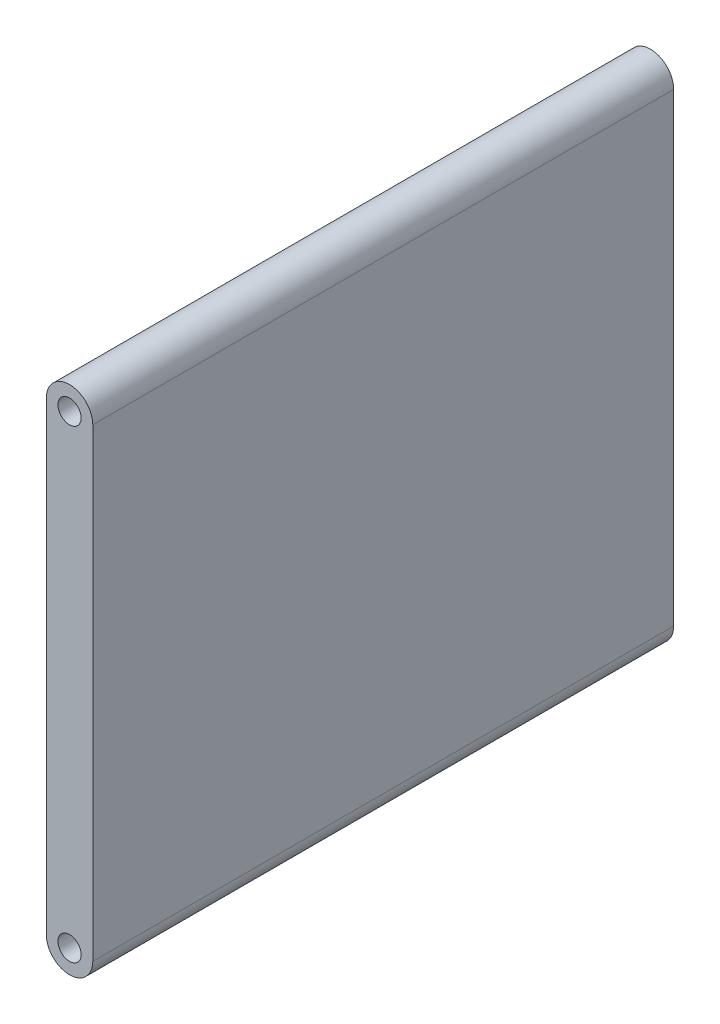
ISO-10303-21;
HEADER;
FILE_DESCRIPTION(('STEP AP214'),'2;1');
FILE_NAME('part.step','',(''),(''),'','','');
FILE_SCHEMA(('AUTOMOTIVE_DESIGN { 1 0 10303 214 1 1 1 1 }'));
ENDSEC;
DATA;
#1=APPLICATION_CONTEXT('core data for automotive mechanical design processes');
#2=APPLICATION_PROTOCOL_DEFINITION('international standard','automotive_design',2000,#1);
#3=PRODUCT_CONTEXT('',#1,'mechanical');
#4=PRODUCT('Part','Part','',(#3));
#5=PRODUCT_RELATED_PRODUCT_CATEGORY('part','',(#4));
#6=PRODUCT_DEFINITION_FORMATION('','',#4);
#7=PRODUCT_DEFINITION_CONTEXT('part definition',#1,'design');
#8=PRODUCT_DEFINITION('design','',#6,#7);
#9=PRODUCT_DEFINITION_SHAPE('','',#8);
#10=(LENGTH_UNIT() NAMED_UNIT(*) SI_UNIT(.MILLI.,.METRE.));
#11=(NAMED_UNIT(*) PLANE_ANGLE_UNIT() SI_UNIT($,.RADIAN.));
#12=(NAMED_UNIT(*) SI_UNIT($,.STERADIAN.) SOLID_ANGLE_UNIT());
#13=UNCERTAINTY_MEASURE_WITH_UNIT(LENGTH_MEASURE(1.E-05),#10,'distance_accuracy_value','');
#14=(GEOMETRIC_REPRESENTATION_CONTEXT(3) GLOBAL_UNCERTAINTY_ASSIGNED_CONTEXT((#13)) GLOBAL_UNIT_ASSIGNED_CONTEXT((#10,
#11,#12)) REPRESENTATION_CONTEXT('',''));
#15=CARTESIAN_POINT('',(0.,0.,0.));
#16=DIRECTION('',(0.,0.,1.));
#17=DIRECTION('',(1.,0.,0.));
#18=AXIS2_PLACEMENT_3D('',#15,#16,#17);
#19=CARTESIAN_POINT('',(0.,-28.,70.));
#20=DIRECTION('',(0.,0.,-1.));
#21=DIRECTION('',(-1.,0.,0.));
#22=AXIS2_PLACEMENT_3D('',#19,#20,#21);
#23=PLANE('',#22);
#24=CARTESIAN_POINT('',(0.,-28.,70.));
#25=DIRECTION('',(0.,0.,1.));
#26=DIRECTION('',(-1.,0.,0.));
#27=AXIS2_PLACEMENT_3D('',#24,#25,#26);
#28=CIRCLE('',#27,2.8);
#29=CARTESIAN_POINT('',(-2.8,-28.,70.));
#30=VERTEX_POINT('',#29);
#31=CARTESIAN_POINT('',(2.8,-28.,70.));
#32=VERTEX_POINT('',#31);
#33=EDGE_CURVE('E92',#30,#32,#28,.T.);
#34=ORIENTED_EDGE('',*,*,#33,.T.);
#35=DIRECTION('',(0.,1.,0.));
#36=VECTOR('',#35,1.);
#37=CARTESIAN_POINT('',(2.8,-28.,70.));
#38=LINE('',#37,#36);
#39=CARTESIAN_POINT('',(2.8,28.,70.));
#40=VERTEX_POINT('',#39);
#41=EDGE_CURVE('E87',#32,#40,#38,.T.);
#42=ORIENTED_EDGE('',*,*,#41,.T.);
#43=CARTESIAN_POINT('',(0.,28.,70.));
#44=DIRECTION('',(0.,0.,1.));
#45=DIRECTION('',(1.,0.,0.));
#46=AXIS2_PLACEMENT_3D('',#43,#44,#45);
#47=CIRCLE('',#46,2.8);
#48=CARTESIAN_POINT('',(-2.80000000000001,28.,70.));
#49=VERTEX_POINT('',#48);
#50=EDGE_CURVE('E90',#40,#49,#47,.T.);
#51=ORIENTED_EDGE('',*,*,#50,.T.);
#52=DIRECTION('',(0.,-1.,0.));
#53=VECTOR('',#52,1.);
#54=CARTESIAN_POINT('',(-2.8,-28.,70.));
#55=LINE('',#54,#53);
#56=EDGE_CURVE('E57',#49,#30,#55,.T.);
#57=ORIENTED_EDGE('',*,*,#56,.T.);
#58=EDGE_LOOP('',(#34,#42,#51,#57));
#59=FACE_BOUND('',#58,.T.);
#60=CARTESIAN_POINT('',(0.,28.,70.));
#61=DIRECTION('',(0.,0.,1.));
#62=DIRECTION('',(1.,0.,0.));
#63=AXIS2_PLACEMENT_3D('',#60,#61,#62);
#64=CIRCLE('',#63,1.4);
#65=CARTESIAN_POINT('',(1.39999999999999,28.,70.));
#66=VERTEX_POINT('',#65);
#67=EDGE_CURVE('E112',#66,#66,#64,.T.);
#68=ORIENTED_EDGE('',*,*,#67,.F.);
#69=EDGE_LOOP('',(#68));
#70=FACE_BOUND('',#69,.T.);
#71=CARTESIAN_POINT('',(0.,-28.,70.));
#72=DIRECTION('',(0.,0.,1.));
#73=DIRECTION('',(1.,0.,0.));
#74=AXIS2_PLACEMENT_3D('',#71,#72,#73);
#75=CIRCLE('',#74,1.4);
#76=CARTESIAN_POINT('',(1.4,-28.,70.));
#77=VERTEX_POINT('',#76);
#78=EDGE_CURVE('E134',#77,#77,#75,.T.);
#79=ORIENTED_EDGE('',*,*,#78,.F.);
#80=EDGE_LOOP('',(#79));
#81=FACE_BOUND('',#80,.T.);
#82=ADVANCED_FACE('F39',(#59,#70,#81),#23,.F.);
#83=CARTESIAN_POINT('',(0.,-28.,0.));
#84=DIRECTION('',(0.,0.,-1.));
#85=DIRECTION('',(-1.,0.,0.));
#86=AXIS2_PLACEMENT_3D('',#83,#84,#85);
#87=PLANE('',#86);
#88=CARTESIAN_POINT('',(0.,28.,0.));
#89=DIRECTION('',(0.,0.,1.));
#90=DIRECTION('',(1.,0.,0.));
#91=AXIS2_PLACEMENT_3D('',#88,#89,#90);
#92=CIRCLE('',#91,1.4);
#93=CARTESIAN_POINT('',(1.39999999999999,28.,0.));
#94=VERTEX_POINT('',#93);
#95=EDGE_CURVE('E130',#94,#94,#92,.T.);
#96=ORIENTED_EDGE('',*,*,#95,.T.);
#97=EDGE_LOOP('',(#96));
#98=FACE_BOUND('',#97,.T.);
#99=CARTESIAN_POINT('',(0.,-28.,0.));
#100=DIRECTION('',(0.,0.,1.));
#101=DIRECTION('',(-1.,0.,0.));
#102=AXIS2_PLACEMENT_3D('',#99,#100,#101);
#103=CIRCLE('',#102,2.8);
#104=CARTESIAN_POINT('',(-2.8,-28.,0.));
#105=VERTEX_POINT('',#104);
#106=CARTESIAN_POINT('',(2.8,-28.,0.));
#107=VERTEX_POINT('',#106);
#108=EDGE_CURVE('E108',#105,#107,#103,.T.);
#109=ORIENTED_EDGE('',*,*,#108,.F.);
#110=DIRECTION('',(0.,-1.,0.));
#111=VECTOR('',#110,1.);
#112=CARTESIAN_POINT('',(-2.8,-28.,0.));
#113=LINE('',#112,#111);
#114=CARTESIAN_POINT('',(-2.80000000000001,28.,0.));
#115=VERTEX_POINT('',#114);
#116=EDGE_CURVE('E80',#115,#105,#113,.T.);
#117=ORIENTED_EDGE('',*,*,#116,.F.);
#118=CARTESIAN_POINT('',(0.,28.,0.));
#119=DIRECTION('',(0.,0.,1.));
#120=DIRECTION('',(1.,0.,0.));
#121=AXIS2_PLACEMENT_3D('',#118,#119,#120);
#122=CIRCLE('',#121,2.8);
#123=CARTESIAN_POINT('',(2.8,28.,0.));
#124=VERTEX_POINT('',#123);
#125=EDGE_CURVE('E74',#124,#115,#122,.T.);
#126=ORIENTED_EDGE('',*,*,#125,.F.);
#127=DIRECTION('',(0.,1.,0.));
#128=VECTOR('',#127,1.);
#129=CARTESIAN_POINT('',(2.8,-28.,0.));
#130=LINE('',#129,#128);
#131=EDGE_CURVE('E97',#107,#124,#130,.T.);
#132=ORIENTED_EDGE('',*,*,#131,.F.);
#133=EDGE_LOOP('',(#109,#117,#126,#132));
#134=FACE_BOUND('',#133,.T.);
#135=CARTESIAN_POINT('',(0.,-28.,0.));
#136=DIRECTION('',(0.,0.,1.));
#137=DIRECTION('',(1.,0.,0.));
#138=AXIS2_PLACEMENT_3D('',#135,#136,#137);
#139=CIRCLE('',#138,1.4);
#140=CARTESIAN_POINT('',(1.4,-28.,0.));
#141=VERTEX_POINT('',#140);
#142=EDGE_CURVE('E138',#141,#141,#139,.T.);
#143=ORIENTED_EDGE('',*,*,#142,.T.);
#144=EDGE_LOOP('',(#143));
#145=FACE_BOUND('',#144,.T.);
#146=ADVANCED_FACE('F125',(#98,#134,#145),#87,.T.);
#147=CARTESIAN_POINT('',(0.,-28.,70.));
#148=DIRECTION('',(0.,0.,-1.));
#149=DIRECTION('',(-1.,0.,0.));
#150=AXIS2_PLACEMENT_3D('',#147,#148,#149);
#151=CYLINDRICAL_SURFACE('',#150,2.8);
#152=ORIENTED_EDGE('',*,*,#108,.T.);
#153=DIRECTION('',(0.,0.,-1.));
#154=VECTOR('',#153,1.);
#155=CARTESIAN_POINT('',(2.8,-28.,70.));
#156=LINE('',#155,#154);
#157=EDGE_CURVE('E11',#32,#107,#156,.T.);
#158=ORIENTED_EDGE('',*,*,#157,.F.);
#159=ORIENTED_EDGE('',*,*,#33,.F.);
#160=DIRECTION('',(0.,0.,-1.));
#161=VECTOR('',#160,1.);
#162=CARTESIAN_POINT('',(-2.8,-28.,70.));
#163=LINE('',#162,#161);
#164=EDGE_CURVE('E104',#30,#105,#163,.T.);
#165=ORIENTED_EDGE('',*,*,#164,.T.);
#166=EDGE_LOOP('',(#152,#158,#159,#165));
#167=FACE_BOUND('',#166,.T.);
#168=ADVANCED_FACE('F41',(#167),#151,.T.);
#169=CARTESIAN_POINT('',(2.8,-28.,70.));
#170=DIRECTION('',(-1.,0.,0.));
#171=DIRECTION('',(0.,0.,1.));
#172=AXIS2_PLACEMENT_3D('',#169,#170,#171);
#173=PLANE('',#172);
#174=ORIENTED_EDGE('',*,*,#131,.T.);
#175=DIRECTION('',(0.,0.,-1.));
#176=VECTOR('',#175,1.);
#177=CARTESIAN_POINT('',(2.8,28.,70.));
#178=LINE('',#177,#176);
#179=EDGE_CURVE('E49',#40,#124,#178,.T.);
#180=ORIENTED_EDGE('',*,*,#179,.F.);
#181=ORIENTED_EDGE('',*,*,#41,.F.);
#182=ORIENTED_EDGE('',*,*,#157,.T.);
#183=EDGE_LOOP('',(#174,#180,#181,#182));
#184=FACE_BOUND('',#183,.T.);
#185=ADVANCED_FACE('F96',(#184),#173,.F.);
#186=CARTESIAN_POINT('',(0.,28.,70.));
#187=DIRECTION('',(0.,0.,-1.));
#188=DIRECTION('',(-1.,0.,0.));
#189=AXIS2_PLACEMENT_3D('',#186,#187,#188);
#190=CYLINDRICAL_SURFACE('',#189,2.8);
#191=ORIENTED_EDGE('',*,*,#125,.T.);
#192=DIRECTION('',(0.,0.,-1.));
#193=VECTOR('',#192,1.);
#194=CARTESIAN_POINT('',(-2.80000000000001,28.,70.));
#195=LINE('',#194,#193);
#196=EDGE_CURVE('E99',#49,#115,#195,.T.);
#197=ORIENTED_EDGE('',*,*,#196,.F.);
#198=ORIENTED_EDGE('',*,*,#50,.F.);
#199=ORIENTED_EDGE('',*,*,#179,.T.);
#200=EDGE_LOOP('',(#191,#197,#198,#199));
#201=FACE_BOUND('',#200,.T.);
#202=ADVANCED_FACE('F100',(#201),#190,.T.);
#203=CARTESIAN_POINT('',(-2.8,-28.,70.));
#204=DIRECTION('',(1.,0.,0.));
#205=DIRECTION('',(0.,0.,-1.));
#206=AXIS2_PLACEMENT_3D('',#203,#204,#205);
#207=PLANE('',#206);
#208=ORIENTED_EDGE('',*,*,#116,.T.);
#209=ORIENTED_EDGE('',*,*,#164,.F.);
#210=ORIENTED_EDGE('',*,*,#56,.F.);
#211=ORIENTED_EDGE('',*,*,#196,.T.);
#212=EDGE_LOOP('',(#208,#209,#210,#211));
#213=FACE_BOUND('',#212,.T.);
#214=ADVANCED_FACE('F122',(#213),#207,.F.);
#215=CARTESIAN_POINT('',(0.,28.,70.));
#216=DIRECTION('',(0.,0.,-1.));
#217=DIRECTION('',(-1.,0.,0.));
#218=AXIS2_PLACEMENT_3D('',#215,#216,#217);
#219=CYLINDRICAL_SURFACE('',#218,1.4);
#220=ORIENTED_EDGE('',*,*,#67,.T.);
#221=EDGE_LOOP('',(#220));
#222=FACE_BOUND('',#221,.T.);
#223=ORIENTED_EDGE('',*,*,#95,.F.);
#224=EDGE_LOOP('',(#223));
#225=FACE_BOUND('',#224,.T.);
#226=ADVANCED_FACE('F157',(#222,#225),#219,.F.);
#227=CARTESIAN_POINT('',(0.,-28.,70.));
#228=DIRECTION('',(0.,0.,-1.));
#229=DIRECTION('',(-1.,0.,0.));
#230=AXIS2_PLACEMENT_3D('',#227,#228,#229);
#231=CYLINDRICAL_SURFACE('',#230,1.4);
#232=ORIENTED_EDGE('',*,*,#78,.T.);
#233=EDGE_LOOP('',(#232));
#234=FACE_BOUND('',#233,.T.);
#235=ORIENTED_EDGE('',*,*,#142,.F.);
#236=EDGE_LOOP('',(#235));
#237=FACE_BOUND('',#236,.T.);
#238=ADVANCED_FACE('F146',(#234,#237),#231,.F.);
#239=CLOSED_SHELL('',(#82,#146,#168,#185,#202,#214,#226,#238));
#240=MANIFOLD_SOLID_BREP('B2',#239);
#241=ADVANCED_BREP_SHAPE_REPRESENTATION('',(#18,#240),#14);
#242=SHAPE_DEFINITION_REPRESENTATION(#9,#241);
ENDSEC;
END-ISO-10303-21;
